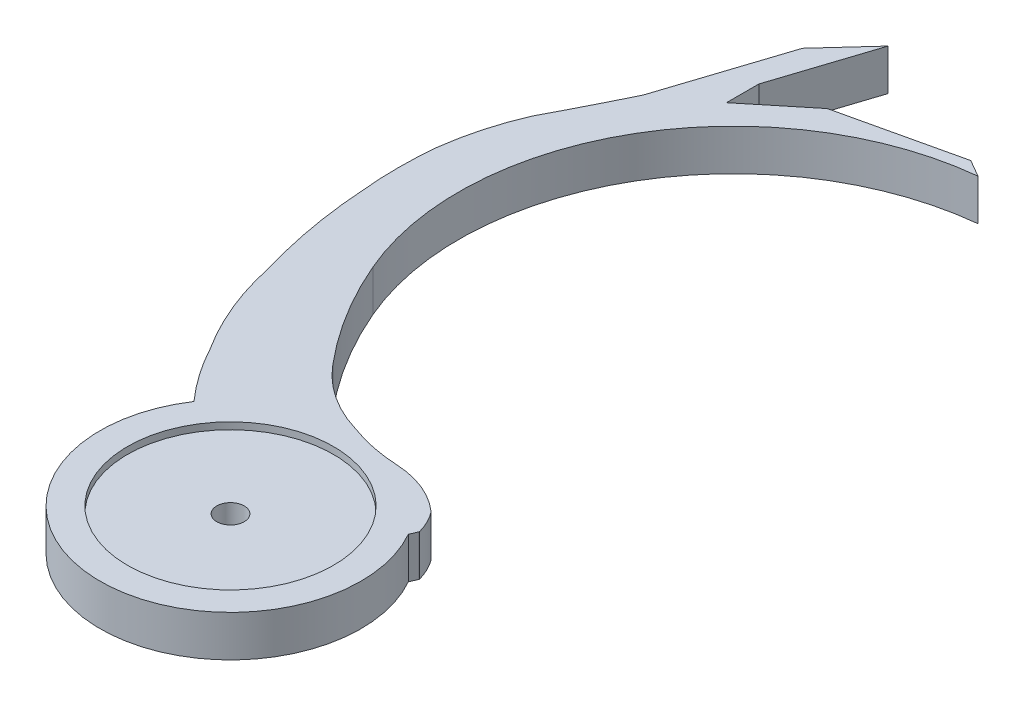
ISO-10303-21;
HEADER;
FILE_DESCRIPTION(('STEP AP214'),'2;1');
FILE_NAME('part.step','',(''),(''),'','','');
FILE_SCHEMA(('AUTOMOTIVE_DESIGN { 1 0 10303 214 1 1 1 1 }'));
ENDSEC;
DATA;
#1=APPLICATION_CONTEXT('core data for automotive mechanical design processes');
#2=APPLICATION_PROTOCOL_DEFINITION('international standard','automotive_design',2000,#1);
#3=PRODUCT_CONTEXT('',#1,'mechanical');
#4=PRODUCT('Part','Part','',(#3));
#5=PRODUCT_RELATED_PRODUCT_CATEGORY('part','',(#4));
#6=PRODUCT_DEFINITION_FORMATION('','',#4);
#7=PRODUCT_DEFINITION_CONTEXT('part definition',#1,'design');
#8=PRODUCT_DEFINITION('design','',#6,#7);
#9=PRODUCT_DEFINITION_SHAPE('','',#8);
#10=(LENGTH_UNIT() NAMED_UNIT(*) SI_UNIT(.MILLI.,.METRE.));
#11=(NAMED_UNIT(*) PLANE_ANGLE_UNIT() SI_UNIT($,.RADIAN.));
#12=(NAMED_UNIT(*) SI_UNIT($,.STERADIAN.) SOLID_ANGLE_UNIT());
#13=UNCERTAINTY_MEASURE_WITH_UNIT(LENGTH_MEASURE(1.E-05),#10,'distance_accuracy_value','');
#14=(GEOMETRIC_REPRESENTATION_CONTEXT(3) GLOBAL_UNCERTAINTY_ASSIGNED_CONTEXT((#13)) GLOBAL_UNIT_ASSIGNED_CONTEXT((#10,
#11,#12)) REPRESENTATION_CONTEXT('',''));
#15=CARTESIAN_POINT('',(0.,0.,0.));
#16=DIRECTION('',(0.,0.,1.));
#17=DIRECTION('',(1.,0.,0.));
#18=AXIS2_PLACEMENT_3D('',#15,#16,#17);
#19=CARTESIAN_POINT('',(-9.66416609923461,4.18336290354014,36.323394248226));
#20=DIRECTION('',(0.,-1.,0.));
#21=DIRECTION('',(0.,0.,-1.));
#22=AXIS2_PLACEMENT_3D('',#19,#20,#21);
#23=CYLINDRICAL_SURFACE('',#22,1.75);
#24=CARTESIAN_POINT('',(-9.66416609923461,-1.06663709645986,36.323394248226));
#25=DIRECTION('',(0.,1.,0.));
#26=DIRECTION('',(0.,0.,1.));
#27=AXIS2_PLACEMENT_3D('',#24,#25,#26);
#28=CIRCLE('',#27,1.75);
#29=CARTESIAN_POINT('',(-9.66416609923461,-1.06663709645986,38.073394248226));
#30=VERTEX_POINT('',#29);
#31=EDGE_CURVE('E267',#30,#30,#28,.T.);
#32=ORIENTED_EDGE('',*,*,#31,.F.);
#33=EDGE_LOOP('',(#32));
#34=FACE_BOUND('',#33,.T.);
#35=CARTESIAN_POINT('',(-9.66416609923461,3.30836290354015,36.323394248226));
#36=DIRECTION('',(0.,1.,0.));
#37=DIRECTION('',(0.,0.,1.));
#38=AXIS2_PLACEMENT_3D('',#35,#36,#37);
#39=CIRCLE('',#38,1.75);
#40=CARTESIAN_POINT('',(-9.66416609923461,3.30836290354015,38.073394248226));
#41=VERTEX_POINT('',#40);
#42=EDGE_CURVE('E45',#41,#41,#39,.T.);
#43=ORIENTED_EDGE('',*,*,#42,.T.);
#44=EDGE_LOOP('',(#43));
#45=FACE_BOUND('',#44,.T.);
#46=ADVANCED_FACE('F41',(#34,#45),#23,.F.);
#47=CARTESIAN_POINT('',(-22.562440081917,4.18336290354014,-11.3836875645976));
#48=DIRECTION('',(1.,0.,0.));
#49=DIRECTION('',(0.,0.,-1.));
#50=AXIS2_PLACEMENT_3D('',#47,#48,#49);
#51=PLANE('',#50);
#52=DIRECTION('',(0.,0.,1.));
#53=VECTOR('',#52,1.);
#54=CARTESIAN_POINT('',(-22.562440081917,-1.06663709645986,-11.3836875645976));
#55=LINE('',#54,#53);
#56=CARTESIAN_POINT('',(-22.5624400819171,-1.06663709645986,-43.9022030869811));
#57=VERTEX_POINT('',#56);
#58=CARTESIAN_POINT('',(-22.5624400819171,-1.06663709645986,-39.7742396032978));
#59=VERTEX_POINT('',#58);
#60=EDGE_CURVE('E219',#57,#59,#55,.T.);
#61=ORIENTED_EDGE('',*,*,#60,.F.);
#62=DIRECTION('',(0.,-1.,0.));
#63=VECTOR('',#62,1.);
#64=CARTESIAN_POINT('',(-22.5624400819171,4.18336290354014,-43.9022030869811));
#65=LINE('',#64,#63);
#66=CARTESIAN_POINT('',(-22.5624400819171,4.18336290354014,-43.9022030869811));
#67=VERTEX_POINT('',#66);
#68=EDGE_CURVE('E11',#67,#57,#65,.T.);
#69=ORIENTED_EDGE('',*,*,#68,.F.);
#70=DIRECTION('',(0.,0.,1.));
#71=VECTOR('',#70,1.);
#72=CARTESIAN_POINT('',(-22.562440081917,4.18336290354014,-11.3836875645976));
#73=LINE('',#72,#71);
#74=CARTESIAN_POINT('',(-22.5624400819171,4.18336290354014,-39.7742396032978));
#75=VERTEX_POINT('',#74);
#76=EDGE_CURVE('E270',#67,#75,#73,.T.);
#77=ORIENTED_EDGE('',*,*,#76,.T.);
#78=DIRECTION('',(0.,-1.,0.));
#79=VECTOR('',#78,1.);
#80=CARTESIAN_POINT('',(-22.5624400819171,4.18336290354014,-39.7742396032978));
#81=LINE('',#80,#79);
#82=EDGE_CURVE('E135',#75,#59,#81,.T.);
#83=ORIENTED_EDGE('',*,*,#82,.T.);
#84=EDGE_LOOP('',(#61,#69,#77,#83));
#85=FACE_BOUND('',#84,.T.);
#86=ADVANCED_FACE('F43',(#85),#51,.T.);
#87=CARTESIAN_POINT('',(-28.7450944321391,4.18336290354014,-24.9176323786269));
#88=DIRECTION('',(0.9508473764207,0.,0.30965992112941));
#89=DIRECTION('',(0.30965992112941,0.,-0.9508473764207));
#90=AXIS2_PLACEMENT_3D('',#87,#88,#89);
#91=PLANE('',#90);
#92=DIRECTION('',(-0.30965992112941,0.,0.9508473764207));
#93=VECTOR('',#92,1.);
#94=CARTESIAN_POINT('',(-28.7450944321391,-1.06663709645986,-24.9176323786269));
#95=LINE('',#94,#93);
#96=CARTESIAN_POINT('',(-18.5190078594824,-1.06663709645986,-56.3180394871661));
#97=VERTEX_POINT('',#96);
#98=EDGE_CURVE('E222',#97,#57,#95,.T.);
#99=ORIENTED_EDGE('',*,*,#98,.F.);
#100=DIRECTION('',(0.,-1.,0.));
#101=VECTOR('',#100,1.);
#102=CARTESIAN_POINT('',(-18.5190078594824,4.18336290354014,-56.3180394871661));
#103=LINE('',#102,#101);
#104=CARTESIAN_POINT('',(-18.5190078594824,4.18336290354014,-56.3180394871661));
#105=VERTEX_POINT('',#104);
#106=EDGE_CURVE('E51',#105,#97,#103,.T.);
#107=ORIENTED_EDGE('',*,*,#106,.F.);
#108=DIRECTION('',(-0.30965992112941,0.,0.9508473764207));
#109=VECTOR('',#108,1.);
#110=CARTESIAN_POINT('',(-28.7450944321391,4.18336290354014,-24.9176323786269));
#111=LINE('',#110,#109);
#112=EDGE_CURVE('E336',#105,#67,#111,.T.);
#113=ORIENTED_EDGE('',*,*,#112,.T.);
#114=ORIENTED_EDGE('',*,*,#68,.T.);
#115=EDGE_LOOP('',(#99,#107,#113,#114));
#116=FACE_BOUND('',#115,.T.);
#117=ADVANCED_FACE('F335',(#116),#91,.T.);
#118=CARTESIAN_POINT('',(-26.6414658537518,4.18336290354014,-47.4269807712445));
#119=DIRECTION('',(0.738297960081065,0.,0.674474700889617));
#120=DIRECTION('',(0.674474700889617,0.,-0.738297960081065));
#121=AXIS2_PLACEMENT_3D('',#118,#119,#120);
#122=PLANE('',#121);
#123=DIRECTION('',(-0.674474700889617,0.,0.738297960081065));
#124=VECTOR('',#123,1.);
#125=CARTESIAN_POINT('',(-26.6414658537518,-1.06663709645986,-47.4269807712445));
#126=LINE('',#125,#124);
#127=CARTESIAN_POINT('',(-23.7263406167607,-1.06663709645986,-50.6179544475183));
#128=VERTEX_POINT('',#127);
#129=EDGE_CURVE('E225',#97,#128,#126,.T.);
#130=ORIENTED_EDGE('',*,*,#129,.T.);
#131=DIRECTION('',(0.,-1.,0.));
#132=VECTOR('',#131,1.);
#133=CARTESIAN_POINT('',(-23.7263406167607,4.18336290354014,-50.6179544475183));
#134=LINE('',#133,#132);
#135=CARTESIAN_POINT('',(-23.7263406167607,4.18336290354014,-50.6179544475183));
#136=VERTEX_POINT('',#135);
#137=EDGE_CURVE('E317',#136,#128,#134,.T.);
#138=ORIENTED_EDGE('',*,*,#137,.F.);
#139=DIRECTION('',(-0.674474700889617,0.,0.738297960081065));
#140=VECTOR('',#139,1.);
#141=CARTESIAN_POINT('',(-26.6414658537518,4.18336290354014,-47.4269807712445));
#142=LINE('',#141,#140);
#143=EDGE_CURVE('E325',#105,#136,#142,.T.);
#144=ORIENTED_EDGE('',*,*,#143,.F.);
#145=ORIENTED_EDGE('',*,*,#106,.T.);
#146=EDGE_LOOP('',(#130,#138,#144,#145));
#147=FACE_BOUND('',#146,.T.);
#148=ADVANCED_FACE('F323',(#147),#122,.F.);
#149=CARTESIAN_POINT('',(-31.7747706861074,4.18336290354014,-25.9042989384933));
#150=DIRECTION('',(0.950847376420702,0.,0.309659921129401));
#151=DIRECTION('',(0.309659921129401,0.,-0.950847376420702));
#152=AXIS2_PLACEMENT_3D('',#149,#150,#151);
#153=PLANE('',#152);
#154=DIRECTION('',(-0.309659921129401,0.,0.950847376420703));
#155=VECTOR('',#154,1.);
#156=CARTESIAN_POINT('',(-31.7747706861074,-1.06663709645986,-25.9042989384933));
#157=LINE('',#156,#155);
#158=CARTESIAN_POINT('',(-28.708043021893,-1.06663709645986,-35.3210485878498));
#159=VERTEX_POINT('',#158);
#160=EDGE_CURVE('E227',#128,#159,#157,.T.);
#161=ORIENTED_EDGE('',*,*,#160,.T.);
#162=DIRECTION('',(0.,-1.,0.));
#163=VECTOR('',#162,1.);
#164=CARTESIAN_POINT('',(-28.708043021893,4.18336290354014,-35.3210485878498));
#165=LINE('',#164,#163);
#166=CARTESIAN_POINT('',(-28.708043021893,4.18336290354014,-35.3210485878498));
#167=VERTEX_POINT('',#166);
#168=EDGE_CURVE('E314',#167,#159,#165,.T.);
#169=ORIENTED_EDGE('',*,*,#168,.F.);
#170=DIRECTION('',(-0.309659921129401,0.,0.950847376420703));
#171=VECTOR('',#170,1.);
#172=CARTESIAN_POINT('',(-31.7747706861074,4.18336290354014,-25.9042989384933));
#173=LINE('',#172,#171);
#174=EDGE_CURVE('E345',#136,#167,#173,.T.);
#175=ORIENTED_EDGE('',*,*,#174,.F.);
#176=ORIENTED_EDGE('',*,*,#137,.T.);
#177=EDGE_LOOP('',(#161,#169,#175,#176));
#178=FACE_BOUND('',#177,.T.);
#179=ADVANCED_FACE('F449',(#178),#153,.F.);
#180=CARTESIAN_POINT('',(-295.873895869123,4.18336290354014,-164.689659395593));
#181=DIRECTION('',(0.,-1.,0.));
#182=DIRECTION('',(0.,0.,-1.));
#183=AXIS2_PLACEMENT_3D('',#180,#181,#182);
#184=CYLINDRICAL_SURFACE('',#183,296.8397385626);
#185=CARTESIAN_POINT('',(-295.873895869123,-1.06663709645986,-164.689659395593));
#186=DIRECTION('',(0.,1.,0.));
#187=DIRECTION('',(0.,0.,1.));
#188=AXIS2_PLACEMENT_3D('',#185,#186,#187);
#189=CIRCLE('',#188,296.8397385626);
#190=CARTESIAN_POINT('',(-33.4652339449699,-1.06663709645986,-25.9253825189827));
#191=VERTEX_POINT('',#190);
#192=EDGE_CURVE('E229',#159,#191,#189,.F.);
#193=ORIENTED_EDGE('',*,*,#192,.T.);
#194=DIRECTION('',(0.,-1.,0.));
#195=VECTOR('',#194,1.);
#196=CARTESIAN_POINT('',(-33.4652339449699,4.18336290354014,-25.9253825189827));
#197=LINE('',#196,#195);
#198=CARTESIAN_POINT('',(-33.4652339449699,4.18336290354014,-25.9253825189827));
#199=VERTEX_POINT('',#198);
#200=EDGE_CURVE('E311',#199,#191,#197,.T.);
#201=ORIENTED_EDGE('',*,*,#200,.F.);
#202=CARTESIAN_POINT('',(-295.873895869123,4.18336290354014,-164.689659395593));
#203=DIRECTION('',(0.,1.,0.));
#204=DIRECTION('',(0.,0.,1.));
#205=AXIS2_PLACEMENT_3D('',#202,#203,#204);
#206=CIRCLE('',#205,296.8397385626);
#207=EDGE_CURVE('E347',#167,#199,#206,.F.);
#208=ORIENTED_EDGE('',*,*,#207,.F.);
#209=ORIENTED_EDGE('',*,*,#168,.T.);
#210=EDGE_LOOP('',(#193,#201,#208,#209));
#211=FACE_BOUND('',#210,.T.);
#212=ADVANCED_FACE('F444',(#211),#184,.F.);
#213=CARTESIAN_POINT('',(-1.11166103626463,4.18336290354014,-11.9503457248283));
#214=DIRECTION('',(0.,-1.,0.));
#215=DIRECTION('',(0.,0.,-1.));
#216=AXIS2_PLACEMENT_3D('',#213,#214,#215);
#217=CYLINDRICAL_SURFACE('',#216,35.2428054126922);
#218=CARTESIAN_POINT('',(-1.11166103626463,-1.06663709645986,-11.9503457248283));
#219=DIRECTION('',(0.,1.,0.));
#220=DIRECTION('',(0.,0.,1.));
#221=AXIS2_PLACEMENT_3D('',#218,#219,#220);
#222=CIRCLE('',#221,35.2428054126922);
#223=CARTESIAN_POINT('',(-36.0771724864214,-1.06663709645986,-16.3626401830255));
#224=VERTEX_POINT('',#223);
#225=EDGE_CURVE('E231',#191,#224,#222,.T.);
#226=ORIENTED_EDGE('',*,*,#225,.T.);
#227=DIRECTION('',(0.,-1.,0.));
#228=VECTOR('',#227,1.);
#229=CARTESIAN_POINT('',(-36.0771724864214,4.18336290354014,-16.3626401830255));
#230=LINE('',#229,#228);
#231=CARTESIAN_POINT('',(-36.0771724864214,4.18336290354014,-16.3626401830255));
#232=VERTEX_POINT('',#231);
#233=EDGE_CURVE('E308',#232,#224,#230,.T.);
#234=ORIENTED_EDGE('',*,*,#233,.F.);
#235=CARTESIAN_POINT('',(-1.11166103626463,4.18336290354014,-11.9503457248283));
#236=DIRECTION('',(0.,1.,0.));
#237=DIRECTION('',(0.,0.,1.));
#238=AXIS2_PLACEMENT_3D('',#235,#236,#237);
#239=CIRCLE('',#238,35.2428054126922);
#240=EDGE_CURVE('E349',#199,#232,#239,.T.);
#241=ORIENTED_EDGE('',*,*,#240,.F.);
#242=ORIENTED_EDGE('',*,*,#200,.T.);
#243=EDGE_LOOP('',(#226,#234,#241,#242));
#244=FACE_BOUND('',#243,.T.);
#245=ADVANCED_FACE('F441',(#244),#217,.T.);
#246=CARTESIAN_POINT('',(11.2084770385272,4.18336290354014,-11.6995461847937));
#247=DIRECTION('',(0.,-1.,0.));
#248=DIRECTION('',(0.,0.,-1.));
#249=AXIS2_PLACEMENT_3D('',#246,#247,#248);
#250=CYLINDRICAL_SURFACE('',#249,47.5150196951725);
#251=CARTESIAN_POINT('',(11.2084770385272,-1.06663709645986,-11.6995461847937));
#252=DIRECTION('',(0.,1.,0.));
#253=DIRECTION('',(0.,0.,1.));
#254=AXIS2_PLACEMENT_3D('',#251,#252,#253);
#255=CIRCLE('',#254,47.5150196951725);
#256=CARTESIAN_POINT('',(-36.0771724864217,-1.06663709645986,-7.03645218656274));
#257=VERTEX_POINT('',#256);
#258=EDGE_CURVE('E233',#224,#257,#255,.T.);
#259=ORIENTED_EDGE('',*,*,#258,.T.);
#260=DIRECTION('',(0.,-1.,0.));
#261=VECTOR('',#260,1.);
#262=CARTESIAN_POINT('',(-36.0771724864217,4.18336290354014,-7.03645218656274));
#263=LINE('',#262,#261);
#264=CARTESIAN_POINT('',(-36.0771724864217,4.18336290354014,-7.03645218656274));
#265=VERTEX_POINT('',#264);
#266=EDGE_CURVE('E305',#265,#257,#263,.T.);
#267=ORIENTED_EDGE('',*,*,#266,.F.);
#268=CARTESIAN_POINT('',(11.2084770385272,4.18336290354014,-11.6995461847937));
#269=DIRECTION('',(0.,1.,0.));
#270=DIRECTION('',(0.,0.,1.));
#271=AXIS2_PLACEMENT_3D('',#268,#269,#270);
#272=CIRCLE('',#271,47.5150196951725);
#273=EDGE_CURVE('E351',#232,#265,#272,.T.);
#274=ORIENTED_EDGE('',*,*,#273,.F.);
#275=ORIENTED_EDGE('',*,*,#233,.T.);
#276=EDGE_LOOP('',(#259,#267,#274,#275));
#277=FACE_BOUND('',#276,.T.);
#278=ADVANCED_FACE('F437',(#277),#250,.T.);
#279=CARTESIAN_POINT('',(30.3596903971524,4.18336290354014,-11.3073960036638));
#280=DIRECTION('',(0.,-1.,0.));
#281=DIRECTION('',(0.,0.,-1.));
#282=AXIS2_PLACEMENT_3D('',#279,#280,#281);
#283=CYLINDRICAL_SURFACE('',#282,66.5740017641998);
#284=CARTESIAN_POINT('',(30.3596903971524,-1.06663709645986,-11.3073960036638));
#285=DIRECTION('',(0.,1.,0.));
#286=DIRECTION('',(0.,0.,1.));
#287=AXIS2_PLACEMENT_3D('',#284,#285,#286);
#288=CIRCLE('',#287,66.5740017641998);
#289=CARTESIAN_POINT('',(-33.4652339449706,-1.06663709645986,7.62608607497011));
#290=VERTEX_POINT('',#289);
#291=EDGE_CURVE('E235',#257,#290,#288,.T.);
#292=ORIENTED_EDGE('',*,*,#291,.T.);
#293=DIRECTION('',(0.,-1.,0.));
#294=VECTOR('',#293,1.);
#295=CARTESIAN_POINT('',(-33.4652339449706,4.18336290354014,7.62608607497011));
#296=LINE('',#295,#294);
#297=CARTESIAN_POINT('',(-33.4652339449706,4.18336290354014,7.62608607497011));
#298=VERTEX_POINT('',#297);
#299=EDGE_CURVE('E302',#298,#290,#296,.T.);
#300=ORIENTED_EDGE('',*,*,#299,.F.);
#301=CARTESIAN_POINT('',(30.3596903971524,4.18336290354014,-11.3073960036638));
#302=DIRECTION('',(0.,1.,0.));
#303=DIRECTION('',(0.,0.,1.));
#304=AXIS2_PLACEMENT_3D('',#301,#302,#303);
#305=CIRCLE('',#304,66.5740017641998);
#306=EDGE_CURVE('E353',#265,#298,#305,.T.);
#307=ORIENTED_EDGE('',*,*,#306,.F.);
#308=ORIENTED_EDGE('',*,*,#266,.T.);
#309=EDGE_LOOP('',(#292,#300,#307,#308));
#310=FACE_BOUND('',#309,.T.);
#311=ADVANCED_FACE('F432',(#310),#283,.T.);
#312=CARTESIAN_POINT('',(3.46931508674213,4.18336290354014,-0.0838468615025323));
#313=DIRECTION('',(0.,-1.,0.));
#314=DIRECTION('',(0.,0.,-1.));
#315=AXIS2_PLACEMENT_3D('',#312,#313,#314);
#316=CYLINDRICAL_SURFACE('',#315,37.7306768831535);
#317=CARTESIAN_POINT('',(3.46931508674213,-1.06663709645986,-0.0838468615025323));
#318=DIRECTION('',(0.,1.,0.));
#319=DIRECTION('',(0.,0.,1.));
#320=AXIS2_PLACEMENT_3D('',#317,#318,#319);
#321=CIRCLE('',#320,37.7306768831535);
#322=CARTESIAN_POINT('',(-28.2921737135603,-1.06663709645986,20.283082392786));
#323=VERTEX_POINT('',#322);
#324=EDGE_CURVE('E237',#290,#323,#321,.T.);
#325=ORIENTED_EDGE('',*,*,#324,.T.);
#326=DIRECTION('',(0.,-1.,0.));
#327=VECTOR('',#326,1.);
#328=CARTESIAN_POINT('',(-28.2921737135603,4.18336290354014,20.283082392786));
#329=LINE('',#328,#327);
#330=CARTESIAN_POINT('',(-28.2921737135603,4.18336290354014,20.283082392786));
#331=VERTEX_POINT('',#330);
#332=EDGE_CURVE('E299',#331,#323,#329,.T.);
#333=ORIENTED_EDGE('',*,*,#332,.F.);
#334=CARTESIAN_POINT('',(3.46931508674213,4.18336290354014,-0.0838468615025323));
#335=DIRECTION('',(0.,1.,0.));
#336=DIRECTION('',(0.,0.,1.));
#337=AXIS2_PLACEMENT_3D('',#334,#335,#336);
#338=CIRCLE('',#337,37.7306768831535);
#339=EDGE_CURVE('E355',#298,#331,#338,.T.);
#340=ORIENTED_EDGE('',*,*,#339,.F.);
#341=ORIENTED_EDGE('',*,*,#299,.T.);
#342=EDGE_LOOP('',(#325,#333,#340,#341));
#343=FACE_BOUND('',#342,.T.);
#344=ADVANCED_FACE('F426',(#343),#316,.T.);
#345=CARTESIAN_POINT('',(3.06716016202229,4.18336290354014,3.48158752148588));
#346=DIRECTION('',(0.,-1.,0.));
#347=DIRECTION('',(0.,0.,-1.));
#348=AXIS2_PLACEMENT_3D('',#345,#346,#347);
#349=CYLINDRICAL_SURFACE('',#348,35.5766503627102);
#350=CARTESIAN_POINT('',(3.06716016202229,-1.06663709645986,3.48158752148588));
#351=DIRECTION('',(0.,1.,0.));
#352=DIRECTION('',(0.,0.,1.));
#353=AXIS2_PLACEMENT_3D('',#350,#351,#352);
#354=CIRCLE('',#353,35.5766503627102);
#355=CARTESIAN_POINT('',(-23.5142574569107,-1.06663709645986,27.1274389207993));
#356=VERTEX_POINT('',#355);
#357=EDGE_CURVE('E239',#323,#356,#354,.T.);
#358=ORIENTED_EDGE('',*,*,#357,.T.);
#359=DIRECTION('',(0.,-1.,0.));
#360=VECTOR('',#359,1.);
#361=CARTESIAN_POINT('',(-23.5142574569107,4.18336290354014,27.1274389207993));
#362=LINE('',#361,#360);
#363=CARTESIAN_POINT('',(-23.5142574569107,4.18336290354014,27.1274389207993));
#364=VERTEX_POINT('',#363);
#365=EDGE_CURVE('E296',#364,#356,#362,.T.);
#366=ORIENTED_EDGE('',*,*,#365,.F.);
#367=CARTESIAN_POINT('',(3.06716016202229,4.18336290354014,3.48158752148588));
#368=DIRECTION('',(0.,1.,0.));
#369=DIRECTION('',(0.,0.,1.));
#370=AXIS2_PLACEMENT_3D('',#367,#368,#369);
#371=CIRCLE('',#370,35.5766503627102);
#372=EDGE_CURVE('E357',#331,#364,#371,.T.);
#373=ORIENTED_EDGE('',*,*,#372,.F.);
#374=ORIENTED_EDGE('',*,*,#332,.T.);
#375=EDGE_LOOP('',(#358,#366,#373,#374));
#376=FACE_BOUND('',#375,.T.);
#377=ADVANCED_FACE('F422',(#376),#349,.T.);
#378=CARTESIAN_POINT('',(-9.66416609923461,4.18336290354014,36.323394248226));
#379=DIRECTION('',(0.,-1.,0.));
#380=DIRECTION('',(0.,0.,-1.));
#381=AXIS2_PLACEMENT_3D('',#378,#379,#380);
#382=CYLINDRICAL_SURFACE('',#381,16.625);
#383=CARTESIAN_POINT('',(-9.66416609923461,-1.06663709645986,36.323394248226));
#384=DIRECTION('',(0.,1.,0.));
#385=DIRECTION('',(0.,0.,1.));
#386=AXIS2_PLACEMENT_3D('',#383,#384,#385);
#387=CIRCLE('',#386,16.625);
#388=CARTESIAN_POINT('',(4.79349583227801,-1.06663709645986,28.1156761442648));
#389=VERTEX_POINT('',#388);
#390=EDGE_CURVE('E241',#356,#389,#387,.T.);
#391=ORIENTED_EDGE('',*,*,#390,.T.);
#392=DIRECTION('',(0.,-1.,0.));
#393=VECTOR('',#392,1.);
#394=CARTESIAN_POINT('',(4.79349583227801,4.18336290354014,28.1156761442648));
#395=LINE('',#394,#393);
#396=CARTESIAN_POINT('',(4.79349583227801,4.18336290354014,28.1156761442648));
#397=VERTEX_POINT('',#396);
#398=EDGE_CURVE('E294',#397,#389,#395,.T.);
#399=ORIENTED_EDGE('',*,*,#398,.F.);
#400=CARTESIAN_POINT('',(-9.66416609923461,4.18336290354014,36.323394248226));
#401=DIRECTION('',(0.,1.,0.));
#402=DIRECTION('',(0.,0.,1.));
#403=AXIS2_PLACEMENT_3D('',#400,#401,#402);
#404=CIRCLE('',#403,16.625);
#405=EDGE_CURVE('E359',#364,#397,#404,.T.);
#406=ORIENTED_EDGE('',*,*,#405,.F.);
#407=ORIENTED_EDGE('',*,*,#365,.T.);
#408=EDGE_LOOP('',(#391,#399,#406,#407));
#409=FACE_BOUND('',#408,.T.);
#410=ADVANCED_FACE('F417',(#409),#382,.T.);
#411=CARTESIAN_POINT('',(-16.4170273846854,4.18336290354014,18.3143532362968));
#412=DIRECTION('',(0.,-1.,0.));
#413=DIRECTION('',(0.,0.,-1.));
#414=AXIS2_PLACEMENT_3D('',#411,#412,#413);
#415=CYLINDRICAL_SURFACE('',#414,23.3656205970139);
#416=CARTESIAN_POINT('',(-16.4170273846854,-1.06663709645986,18.3143532362968));
#417=DIRECTION('',(0.,1.,0.));
#418=DIRECTION('',(0.,0.,1.));
#419=AXIS2_PLACEMENT_3D('',#416,#417,#418);
#420=CIRCLE('',#419,23.3656205970139);
#421=CARTESIAN_POINT('',(5.20948538279702,-1.06663709645986,27.160039834946));
#422=VERTEX_POINT('',#421);
#423=EDGE_CURVE('E244',#422,#389,#420,.F.);
#424=ORIENTED_EDGE('',*,*,#423,.F.);
#425=DIRECTION('',(0.,-1.,0.));
#426=VECTOR('',#425,1.);
#427=CARTESIAN_POINT('',(5.20948538279702,4.18336290354014,27.160039834946));
#428=LINE('',#427,#426);
#429=CARTESIAN_POINT('',(5.20948538279702,4.18336290354014,27.160039834946));
#430=VERTEX_POINT('',#429);
#431=EDGE_CURVE('E292',#430,#422,#428,.T.);
#432=ORIENTED_EDGE('',*,*,#431,.F.);
#433=CARTESIAN_POINT('',(-16.4170273846854,4.18336290354014,18.3143532362968));
#434=DIRECTION('',(0.,1.,0.));
#435=DIRECTION('',(0.,0.,1.));
#436=AXIS2_PLACEMENT_3D('',#433,#434,#435);
#437=CIRCLE('',#436,23.3656205970139);
#438=EDGE_CURVE('E361',#430,#397,#437,.F.);
#439=ORIENTED_EDGE('',*,*,#438,.T.);
#440=ORIENTED_EDGE('',*,*,#398,.T.);
#441=EDGE_LOOP('',(#424,#432,#439,#440));
#442=FACE_BOUND('',#441,.T.);
#443=ADVANCED_FACE('F411',(#442),#415,.T.);
#444=CARTESIAN_POINT('',(13.4560748934009,4.18336290354014,29.3685048818782));
#445=DIRECTION('',(0.,-1.,0.));
#446=DIRECTION('',(0.,0.,-1.));
#447=AXIS2_PLACEMENT_3D('',#444,#445,#446);
#448=CYLINDRICAL_SURFACE('',#447,8.53718668062977);
#449=CARTESIAN_POINT('',(13.4560748934009,-1.06663709645986,29.3685048818782));
#450=DIRECTION('',(0.,1.,0.));
#451=DIRECTION('',(0.,0.,1.));
#452=AXIS2_PLACEMENT_3D('',#449,#450,#451);
#453=CIRCLE('',#452,8.53718668062977);
#454=CARTESIAN_POINT('',(5.22205920493274,-1.06663709645986,27.1136119660209));
#455=VERTEX_POINT('',#454);
#456=EDGE_CURVE('E247',#422,#455,#453,.F.);
#457=ORIENTED_EDGE('',*,*,#456,.T.);
#458=DIRECTION('',(0.,-1.,0.));
#459=VECTOR('',#458,1.);
#460=CARTESIAN_POINT('',(5.22205920493274,4.18336290354014,27.1136119660209));
#461=LINE('',#460,#459);
#462=CARTESIAN_POINT('',(5.22205920493274,4.18336290354014,27.1136119660209));
#463=VERTEX_POINT('',#462);
#464=EDGE_CURVE('E289',#463,#455,#461,.T.);
#465=ORIENTED_EDGE('',*,*,#464,.F.);
#466=CARTESIAN_POINT('',(13.4560748934009,4.18336290354014,29.3685048818782));
#467=DIRECTION('',(0.,1.,0.));
#468=DIRECTION('',(0.,0.,1.));
#469=AXIS2_PLACEMENT_3D('',#466,#467,#468);
#470=CIRCLE('',#469,8.53718668062977);
#471=EDGE_CURVE('E364',#430,#463,#470,.F.);
#472=ORIENTED_EDGE('',*,*,#471,.F.);
#473=ORIENTED_EDGE('',*,*,#431,.T.);
#474=EDGE_LOOP('',(#457,#465,#472,#473));
#475=FACE_BOUND('',#474,.T.);
#476=ADVANCED_FACE('F408',(#475),#448,.F.);
#477=CARTESIAN_POINT('',(-3.01195648353539,4.18336290354014,29.3685048818782));
#478=DIRECTION('',(0.,-1.,0.));
#479=DIRECTION('',(0.,0.,-1.));
#480=AXIS2_PLACEMENT_3D('',#477,#478,#479);
#481=CYLINDRICAL_SURFACE('',#480,8.53718668062977);
#482=CARTESIAN_POINT('',(-3.01195648353539,-1.06663709645986,29.3685048818782));
#483=DIRECTION('',(0.,1.,0.));
#484=DIRECTION('',(0.,0.,1.));
#485=AXIS2_PLACEMENT_3D('',#482,#483,#484);
#486=CIRCLE('',#485,8.53718668062977);
#487=CARTESIAN_POINT('',(3.79038949061149,-1.06663709645986,24.2098572230503));
#488=VERTEX_POINT('',#487);
#489=EDGE_CURVE('E249',#455,#488,#486,.T.);
#490=ORIENTED_EDGE('',*,*,#489,.T.);
#491=DIRECTION('',(0.,-1.,0.));
#492=VECTOR('',#491,1.);
#493=CARTESIAN_POINT('',(3.79038949061149,4.18336290354014,24.2098572230503));
#494=LINE('',#493,#492);
#495=CARTESIAN_POINT('',(3.79038949061149,4.18336290354014,24.2098572230503));
#496=VERTEX_POINT('',#495);
#497=EDGE_CURVE('E286',#496,#488,#494,.T.);
#498=ORIENTED_EDGE('',*,*,#497,.F.);
#499=CARTESIAN_POINT('',(-3.01195648353539,4.18336290354014,29.3685048818782));
#500=DIRECTION('',(0.,1.,0.));
#501=DIRECTION('',(0.,0.,1.));
#502=AXIS2_PLACEMENT_3D('',#499,#500,#501);
#503=CIRCLE('',#502,8.53718668062977);
#504=EDGE_CURVE('E366',#463,#496,#503,.T.);
#505=ORIENTED_EDGE('',*,*,#504,.F.);
#506=ORIENTED_EDGE('',*,*,#464,.T.);
#507=EDGE_LOOP('',(#490,#498,#505,#506));
#508=FACE_BOUND('',#507,.T.);
#509=ADVANCED_FACE('F403',(#508),#481,.T.);
#510=CARTESIAN_POINT('',(-4.14462649044133,4.18336290354014,33.1042035083881));
#511=DIRECTION('',(0.,-1.,0.));
#512=DIRECTION('',(0.,0.,-1.));
#513=AXIS2_PLACEMENT_3D('',#510,#511,#512);
#514=CYLINDRICAL_SURFACE('',#513,11.9194745883812);
#515=CARTESIAN_POINT('',(-4.14462649044133,-1.06663709645986,33.1042035083881));
#516=DIRECTION('',(0.,1.,0.));
#517=DIRECTION('',(0.,0.,1.));
#518=AXIS2_PLACEMENT_3D('',#515,#516,#517);
#519=CIRCLE('',#518,11.9194745883812);
#520=CARTESIAN_POINT('',(-3.57079659150943,-1.06663709645986,21.1985496535947));
#521=VERTEX_POINT('',#520);
#522=EDGE_CURVE('E251',#488,#521,#519,.T.);
#523=ORIENTED_EDGE('',*,*,#522,.T.);
#524=DIRECTION('',(0.,-1.,0.));
#525=VECTOR('',#524,1.);
#526=CARTESIAN_POINT('',(-3.57079659150943,4.18336290354014,21.1985496535947));
#527=LINE('',#526,#525);
#528=CARTESIAN_POINT('',(-3.57079659150943,4.18336290354014,21.1985496535947));
#529=VERTEX_POINT('',#528);
#530=EDGE_CURVE('E283',#529,#521,#527,.T.);
#531=ORIENTED_EDGE('',*,*,#530,.F.);
#532=CARTESIAN_POINT('',(-4.14462649044133,4.18336290354014,33.1042035083881));
#533=DIRECTION('',(0.,1.,0.));
#534=DIRECTION('',(0.,0.,1.));
#535=AXIS2_PLACEMENT_3D('',#532,#533,#534);
#536=CIRCLE('',#535,11.9194745883812);
#537=EDGE_CURVE('E368',#496,#529,#536,.T.);
#538=ORIENTED_EDGE('',*,*,#537,.F.);
#539=ORIENTED_EDGE('',*,*,#497,.T.);
#540=EDGE_LOOP('',(#523,#531,#538,#539));
#541=FACE_BOUND('',#540,.T.);
#542=ADVANCED_FACE('F397',(#541),#514,.T.);
#543=CARTESIAN_POINT('',(-2.50499563247774,4.18336290354014,-0.91437496040141));
#544=DIRECTION('',(0.,-1.,0.));
#545=DIRECTION('',(0.,0.,-1.));
#546=AXIS2_PLACEMENT_3D('',#543,#544,#545);
#547=CYLINDRICAL_SURFACE('',#546,22.1385945052649);
#548=CARTESIAN_POINT('',(-2.50499563247774,-1.06663709645986,-0.91437496040141));
#549=DIRECTION('',(0.,1.,0.));
#550=DIRECTION('',(0.,0.,1.));
#551=AXIS2_PLACEMENT_3D('',#548,#549,#550);
#552=CIRCLE('',#551,22.1385945052649);
#553=CARTESIAN_POINT('',(-10.2003482828133,-1.06663709645986,19.8437298243693));
#554=VERTEX_POINT('',#553);
#555=EDGE_CURVE('E253',#521,#554,#552,.F.);
#556=ORIENTED_EDGE('',*,*,#555,.T.);
#557=DIRECTION('',(0.,-1.,0.));
#558=VECTOR('',#557,1.);
#559=CARTESIAN_POINT('',(-10.2003482828133,4.18336290354014,19.8437298243693));
#560=LINE('',#559,#558);
#561=CARTESIAN_POINT('',(-10.2003482828133,4.18336290354014,19.8437298243693));
#562=VERTEX_POINT('',#561);
#563=EDGE_CURVE('E280',#562,#554,#560,.T.);
#564=ORIENTED_EDGE('',*,*,#563,.F.);
#565=CARTESIAN_POINT('',(-2.50499563247774,4.18336290354014,-0.91437496040141));
#566=DIRECTION('',(0.,1.,0.));
#567=DIRECTION('',(0.,0.,1.));
#568=AXIS2_PLACEMENT_3D('',#565,#566,#567);
#569=CIRCLE('',#568,22.1385945052649);
#570=EDGE_CURVE('E370',#529,#562,#569,.F.);
#571=ORIENTED_EDGE('',*,*,#570,.F.);
#572=ORIENTED_EDGE('',*,*,#530,.T.);
#573=EDGE_LOOP('',(#556,#564,#571,#572));
#574=FACE_BOUND('',#573,.T.);
#575=ADVANCED_FACE('F393',(#574),#547,.F.);
#576=CARTESIAN_POINT('',(-5.25354003598053,4.18336290354014,3.06597548894517));
#577=DIRECTION('',(0.,-1.,0.));
#578=DIRECTION('',(0.,0.,-1.));
#579=AXIS2_PLACEMENT_3D('',#576,#577,#578);
#580=CYLINDRICAL_SURFACE('',#579,17.4918253012879);
#581=CARTESIAN_POINT('',(-5.25354003598053,-1.06663709645986,3.06597548894517));
#582=DIRECTION('',(0.,1.,0.));
#583=DIRECTION('',(0.,0.,1.));
#584=AXIS2_PLACEMENT_3D('',#581,#582,#583);
#585=CIRCLE('',#584,17.4918253012879);
#586=CARTESIAN_POINT('',(-18.7056623503037,-1.06663709645986,14.2465102530458));
#587=VERTEX_POINT('',#586);
#588=EDGE_CURVE('E255',#554,#587,#585,.F.);
#589=ORIENTED_EDGE('',*,*,#588,.T.);
#590=DIRECTION('',(0.,-1.,0.));
#591=VECTOR('',#590,1.);
#592=CARTESIAN_POINT('',(-18.7056623503037,4.18336290354014,14.2465102530458));
#593=LINE('',#592,#591);
#594=CARTESIAN_POINT('',(-18.7056623503037,4.18336290354014,14.2465102530458));
#595=VERTEX_POINT('',#594);
#596=EDGE_CURVE('E277',#595,#587,#593,.T.);
#597=ORIENTED_EDGE('',*,*,#596,.F.);
#598=CARTESIAN_POINT('',(-5.25354003598053,4.18336290354014,3.06597548894517));
#599=DIRECTION('',(0.,1.,0.));
#600=DIRECTION('',(0.,0.,1.));
#601=AXIS2_PLACEMENT_3D('',#598,#599,#600);
#602=CIRCLE('',#601,17.4918253012879);
#603=EDGE_CURVE('E372',#562,#595,#602,.F.);
#604=ORIENTED_EDGE('',*,*,#603,.F.);
#605=ORIENTED_EDGE('',*,*,#563,.T.);
#606=EDGE_LOOP('',(#589,#597,#604,#605));
#607=FACE_BOUND('',#606,.T.);
#608=ADVANCED_FACE('F389',(#607),#580,.F.);
#609=CARTESIAN_POINT('',(21.7921186772506,4.18336290354014,-19.9825397466189));
#610=DIRECTION('',(0.,-1.,0.));
#611=DIRECTION('',(0.,0.,-1.));
#612=AXIS2_PLACEMENT_3D('',#609,#610,#611);
#613=CYLINDRICAL_SURFACE('',#612,53.0254479663801);
#614=CARTESIAN_POINT('',(21.7921186772506,-1.06663709645986,-19.9825397466189));
#615=DIRECTION('',(0.,1.,0.));
#616=DIRECTION('',(0.,0.,1.));
#617=AXIS2_PLACEMENT_3D('',#614,#615,#616);
#618=CIRCLE('',#617,53.0254479663801);
#619=CARTESIAN_POINT('',(-26.9520139505759,-1.06663709645986,0.891071977185619));
#620=VERTEX_POINT('',#619);
#621=EDGE_CURVE('E257',#587,#620,#618,.F.);
#622=ORIENTED_EDGE('',*,*,#621,.T.);
#623=DIRECTION('',(0.,-1.,0.));
#624=VECTOR('',#623,1.);
#625=CARTESIAN_POINT('',(-26.9520139505759,4.18336290354014,0.891071977185619));
#626=LINE('',#625,#624);
#627=CARTESIAN_POINT('',(-26.9520139505759,4.18336290354014,0.891071977185619));
#628=VERTEX_POINT('',#627);
#629=EDGE_CURVE('E274',#628,#620,#626,.T.);
#630=ORIENTED_EDGE('',*,*,#629,.F.);
#631=CARTESIAN_POINT('',(21.7921186772506,4.18336290354014,-19.9825397466189));
#632=DIRECTION('',(0.,1.,0.));
#633=DIRECTION('',(0.,0.,1.));
#634=AXIS2_PLACEMENT_3D('',#631,#632,#633);
#635=CIRCLE('',#634,53.0254479663801);
#636=EDGE_CURVE('E374',#595,#628,#635,.F.);
#637=ORIENTED_EDGE('',*,*,#636,.F.);
#638=ORIENTED_EDGE('',*,*,#596,.T.);
#639=EDGE_LOOP('',(#622,#630,#637,#638));
#640=FACE_BOUND('',#639,.T.);
#641=ADVANCED_FACE('F380',(#640),#613,.F.);
#642=CARTESIAN_POINT('',(5.22205920493274,4.18336290354014,-12.886773158538));
#643=DIRECTION('',(0.,-1.,0.));
#644=DIRECTION('',(0.,0.,-1.));
#645=AXIS2_PLACEMENT_3D('',#642,#643,#644);
#646=CYLINDRICAL_SURFACE('',#645,35.);
#647=CARTESIAN_POINT('',(5.22205920493274,-1.06663709645986,-12.886773158538));
#648=DIRECTION('',(0.,1.,0.));
#649=DIRECTION('',(0.,0.,1.));
#650=AXIS2_PLACEMENT_3D('',#647,#648,#649);
#651=CIRCLE('',#650,35.);
#652=CARTESIAN_POINT('',(1.5711765973419,-1.06663709645986,-47.695838876905));
#653=VERTEX_POINT('',#652);
#654=EDGE_CURVE('E259',#620,#653,#651,.F.);
#655=ORIENTED_EDGE('',*,*,#654,.T.);
#656=DIRECTION('',(0.,-1.,0.));
#657=VECTOR('',#656,1.);
#658=CARTESIAN_POINT('',(1.5711765973419,4.18336290354014,-47.695838876905));
#659=LINE('',#658,#657);
#660=CARTESIAN_POINT('',(1.5711765973419,4.18336290354014,-47.695838876905));
#661=VERTEX_POINT('',#660);
#662=EDGE_CURVE('E206',#661,#653,#659,.T.);
#663=ORIENTED_EDGE('',*,*,#662,.F.);
#664=CARTESIAN_POINT('',(5.22205920493274,4.18336290354014,-12.886773158538));
#665=DIRECTION('',(0.,1.,0.));
#666=DIRECTION('',(0.,0.,1.));
#667=AXIS2_PLACEMENT_3D('',#664,#665,#666);
#668=CIRCLE('',#667,35.);
#669=EDGE_CURVE('E211',#628,#661,#668,.F.);
#670=ORIENTED_EDGE('',*,*,#669,.F.);
#671=ORIENTED_EDGE('',*,*,#629,.T.);
#672=EDGE_LOOP('',(#655,#663,#670,#671));
#673=FACE_BOUND('',#672,.T.);
#674=ADVANCED_FACE('F384',(#673),#646,.F.);
#675=CARTESIAN_POINT('',(25.737236022188,4.18336290354014,-33.6994165266074));
#676=DIRECTION('',(0.501184996579342,0.,-0.865340163868386));
#677=DIRECTION('',(-0.865340163868386,0.,-0.501184996579342));
#678=AXIS2_PLACEMENT_3D('',#675,#676,#677);
#679=PLANE('',#678);
#680=DIRECTION('',(0.865340163868386,0.,0.501184996579342));
#681=VECTOR('',#680,1.);
#682=CARTESIAN_POINT('',(25.737236022188,-1.06663709645986,-33.6994165266074));
#683=LINE('',#682,#681);
#684=CARTESIAN_POINT('',(-0.606265385907522,-1.06663709645986,-48.9569628816526));
#685=VERTEX_POINT('',#684);
#686=EDGE_CURVE('E201',#685,#653,#683,.T.);
#687=ORIENTED_EDGE('',*,*,#686,.F.);
#688=DIRECTION('',(0.,-1.,0.));
#689=VECTOR('',#688,1.);
#690=CARTESIAN_POINT('',(-0.606265385907522,4.18336290354014,-48.9569628816526));
#691=LINE('',#690,#689);
#692=CARTESIAN_POINT('',(-0.606265385907522,4.18336290354014,-48.9569628816526));
#693=VERTEX_POINT('',#692);
#694=EDGE_CURVE('E196',#693,#685,#691,.T.);
#695=ORIENTED_EDGE('',*,*,#694,.F.);
#696=DIRECTION('',(0.865340163868386,0.,0.501184996579342));
#697=VECTOR('',#696,1.);
#698=CARTESIAN_POINT('',(25.737236022188,4.18336290354014,-33.6994165266074));
#699=LINE('',#698,#697);
#700=EDGE_CURVE('E199',#693,#661,#699,.T.);
#701=ORIENTED_EDGE('',*,*,#700,.T.);
#702=ORIENTED_EDGE('',*,*,#662,.T.);
#703=EDGE_LOOP('',(#687,#695,#701,#702));
#704=FACE_BOUND('',#703,.T.);
#705=ADVANCED_FACE('F198',(#704),#679,.T.);
#706=CARTESIAN_POINT('',(3.96269913456154,4.18336290354014,-50.0039355752669));
#707=DIRECTION('',(-0.223359601164946,0.,-0.974736112272155));
#708=DIRECTION('',(-0.974736112272156,0.,0.223359601164946));
#709=AXIS2_PLACEMENT_3D('',#706,#707,#708);
#710=PLANE('',#709);
#711=DIRECTION('',(0.974736112272156,0.,-0.223359601164946));
#712=VECTOR('',#711,1.);
#713=CARTESIAN_POINT('',(3.96269913456154,-1.06663709645986,-50.0039355752669));
#714=LINE('',#713,#712);
#715=CARTESIAN_POINT('',(-15.4901181034909,-1.06663709645986,-45.5463460337266));
#716=VERTEX_POINT('',#715);
#717=EDGE_CURVE('E263',#716,#685,#714,.T.);
#718=ORIENTED_EDGE('',*,*,#717,.F.);
#719=DIRECTION('',(0.,-1.,0.));
#720=VECTOR('',#719,1.);
#721=CARTESIAN_POINT('',(-15.4901181034909,4.18336290354014,-45.5463460337266));
#722=LINE('',#721,#720);
#723=CARTESIAN_POINT('',(-15.4901181034909,4.18336290354014,-45.5463460337266));
#724=VERTEX_POINT('',#723);
#725=EDGE_CURVE('E128',#724,#716,#722,.T.);
#726=ORIENTED_EDGE('',*,*,#725,.F.);
#727=DIRECTION('',(0.974736112272156,0.,-0.223359601164946));
#728=VECTOR('',#727,1.);
#729=CARTESIAN_POINT('',(3.96269913456154,4.18336290354014,-50.0039355752669));
#730=LINE('',#729,#728);
#731=EDGE_CURVE('E209',#724,#693,#730,.T.);
#732=ORIENTED_EDGE('',*,*,#731,.T.);
#733=ORIENTED_EDGE('',*,*,#694,.T.);
#734=EDGE_LOOP('',(#718,#726,#732,#733));
#735=FACE_BOUND('',#734,.T.);
#736=ADVANCED_FACE('F214',(#735),#710,.T.);
#737=CARTESIAN_POINT('',(-15.2376748923556,4.18336290354014,-45.7523786615901));
#738=DIRECTION('',(0.632296442931859,0.,0.774726537725227));
#739=DIRECTION('',(0.774726537725227,0.,-0.632296442931859));
#740=AXIS2_PLACEMENT_3D('',#737,#738,#739);
#741=PLANE('',#740);
#742=DIRECTION('',(-0.774726537725227,0.,0.632296442931859));
#743=VECTOR('',#742,1.);
#744=CARTESIAN_POINT('',(-15.2376748923556,-1.06663709645986,-45.7523786615901));
#745=LINE('',#744,#743);
#746=EDGE_CURVE('E265',#716,#59,#745,.T.);
#747=ORIENTED_EDGE('',*,*,#746,.T.);
#748=ORIENTED_EDGE('',*,*,#82,.F.);
#749=DIRECTION('',(-0.774726537725227,0.,0.632296442931859));
#750=VECTOR('',#749,1.);
#751=CARTESIAN_POINT('',(-15.2376748923556,4.18336290354014,-45.7523786615901));
#752=LINE('',#751,#750);
#753=EDGE_CURVE('E59',#724,#75,#752,.T.);
#754=ORIENTED_EDGE('',*,*,#753,.F.);
#755=ORIENTED_EDGE('',*,*,#725,.T.);
#756=EDGE_LOOP('',(#747,#748,#754,#755));
#757=FACE_BOUND('',#756,.T.);
#758=ADVANCED_FACE('F337',(#757),#741,.F.);
#759=CARTESIAN_POINT('',(12.812482254268,4.18336290354014,-11.3836875645976));
#760=DIRECTION('',(0.,1.,0.));
#761=DIRECTION('',(0.,0.,1.));
#762=AXIS2_PLACEMENT_3D('',#759,#760,#761);
#763=PLANE('',#762);
#764=CARTESIAN_POINT('',(-9.66416609923461,4.18336290354014,36.323394248226));
#765=DIRECTION('',(0.,1.,0.));
#766=DIRECTION('',(0.,0.,1.));
#767=AXIS2_PLACEMENT_3D('',#764,#765,#766);
#768=CIRCLE('',#767,13.125);
#769=CARTESIAN_POINT('',(-9.66416609923461,4.18336290354014,49.4483942482259));
#770=VERTEX_POINT('',#769);
#771=EDGE_CURVE('E341',#770,#770,#768,.T.);
#772=ORIENTED_EDGE('',*,*,#771,.F.);
#773=EDGE_LOOP('',(#772));
#774=FACE_BOUND('',#773,.T.);
#775=ORIENTED_EDGE('',*,*,#76,.F.);
#776=ORIENTED_EDGE('',*,*,#112,.F.);
#777=ORIENTED_EDGE('',*,*,#143,.T.);
#778=ORIENTED_EDGE('',*,*,#174,.T.);
#779=ORIENTED_EDGE('',*,*,#207,.T.);
#780=ORIENTED_EDGE('',*,*,#240,.T.);
#781=ORIENTED_EDGE('',*,*,#273,.T.);
#782=ORIENTED_EDGE('',*,*,#306,.T.);
#783=ORIENTED_EDGE('',*,*,#339,.T.);
#784=ORIENTED_EDGE('',*,*,#372,.T.);
#785=ORIENTED_EDGE('',*,*,#405,.T.);
#786=ORIENTED_EDGE('',*,*,#438,.F.);
#787=ORIENTED_EDGE('',*,*,#471,.T.);
#788=ORIENTED_EDGE('',*,*,#504,.T.);
#789=ORIENTED_EDGE('',*,*,#537,.T.);
#790=ORIENTED_EDGE('',*,*,#570,.T.);
#791=ORIENTED_EDGE('',*,*,#603,.T.);
#792=ORIENTED_EDGE('',*,*,#636,.T.);
#793=ORIENTED_EDGE('',*,*,#669,.T.);
#794=ORIENTED_EDGE('',*,*,#700,.F.);
#795=ORIENTED_EDGE('',*,*,#731,.F.);
#796=ORIENTED_EDGE('',*,*,#753,.T.);
#797=EDGE_LOOP('',(#775,#776,#777,#778,#779,#780,#781,#782,#783,#784,#785,#786,#787,#788,#789,
#790,#791,#792,#793,#794,#795,#796));
#798=FACE_BOUND('',#797,.T.);
#799=ADVANCED_FACE('F208',(#774,#798),#763,.T.);
#800=CARTESIAN_POINT('',(12.812482254268,-1.06663709645986,-11.3836875645976));
#801=DIRECTION('',(0.,1.,0.));
#802=DIRECTION('',(0.,0.,1.));
#803=AXIS2_PLACEMENT_3D('',#800,#801,#802);
#804=PLANE('',#803);
#805=ORIENTED_EDGE('',*,*,#60,.T.);
#806=ORIENTED_EDGE('',*,*,#746,.F.);
#807=ORIENTED_EDGE('',*,*,#717,.T.);
#808=ORIENTED_EDGE('',*,*,#686,.T.);
#809=ORIENTED_EDGE('',*,*,#654,.F.);
#810=ORIENTED_EDGE('',*,*,#621,.F.);
#811=ORIENTED_EDGE('',*,*,#588,.F.);
#812=ORIENTED_EDGE('',*,*,#555,.F.);
#813=ORIENTED_EDGE('',*,*,#522,.F.);
#814=ORIENTED_EDGE('',*,*,#489,.F.);
#815=ORIENTED_EDGE('',*,*,#456,.F.);
#816=ORIENTED_EDGE('',*,*,#423,.T.);
#817=ORIENTED_EDGE('',*,*,#390,.F.);
#818=ORIENTED_EDGE('',*,*,#357,.F.);
#819=ORIENTED_EDGE('',*,*,#324,.F.);
#820=ORIENTED_EDGE('',*,*,#291,.F.);
#821=ORIENTED_EDGE('',*,*,#258,.F.);
#822=ORIENTED_EDGE('',*,*,#225,.F.);
#823=ORIENTED_EDGE('',*,*,#192,.F.);
#824=ORIENTED_EDGE('',*,*,#160,.F.);
#825=ORIENTED_EDGE('',*,*,#129,.F.);
#826=ORIENTED_EDGE('',*,*,#98,.T.);
#827=EDGE_LOOP('',(#805,#806,#807,#808,#809,#810,#811,#812,#813,#814,#815,#816,#817,#818,#819,
#820,#821,#822,#823,#824,#825,#826));
#828=FACE_BOUND('',#827,.T.);
#829=ORIENTED_EDGE('',*,*,#31,.T.);
#830=EDGE_LOOP('',(#829));
#831=FACE_BOUND('',#830,.T.);
#832=ADVANCED_FACE('F332',(#828,#831),#804,.F.);
#833=CARTESIAN_POINT('',(-9.66416609923461,3.30836290354015,36.323394248226));
#834=DIRECTION('',(0.,1.,0.));
#835=DIRECTION('',(0.,0.,1.));
#836=AXIS2_PLACEMENT_3D('',#833,#834,#835);
#837=CYLINDRICAL_SURFACE('',#836,13.125);
#838=CARTESIAN_POINT('',(-9.66416609923461,3.30836290354015,36.323394248226));
#839=DIRECTION('',(0.,1.,0.));
#840=DIRECTION('',(0.,0.,1.));
#841=AXIS2_PLACEMENT_3D('',#838,#839,#840);
#842=CIRCLE('',#841,13.125);
#843=CARTESIAN_POINT('',(-9.66416609923461,3.30836290354015,49.4483942482259));
#844=VERTEX_POINT('',#843);
#845=EDGE_CURVE('E698',#844,#844,#842,.T.);
#846=ORIENTED_EDGE('',*,*,#845,.F.);
#847=EDGE_LOOP('',(#846));
#848=FACE_BOUND('',#847,.T.);
#849=ORIENTED_EDGE('',*,*,#771,.T.);
#850=EDGE_LOOP('',(#849));
#851=FACE_BOUND('',#850,.T.);
#852=ADVANCED_FACE('F582',(#848,#851),#837,.F.);
#853=CARTESIAN_POINT('',(-9.66416609923461,3.30836290354015,36.323394248226));
#854=DIRECTION('',(0.,1.,0.));
#855=DIRECTION('',(0.,0.,1.));
#856=AXIS2_PLACEMENT_3D('',#853,#854,#855);
#857=PLANE('',#856);
#858=ORIENTED_EDGE('',*,*,#42,.F.);
#859=EDGE_LOOP('',(#858));
#860=FACE_BOUND('',#859,.T.);
#861=ORIENTED_EDGE('',*,*,#845,.T.);
#862=EDGE_LOOP('',(#861));
#863=FACE_BOUND('',#862,.T.);
#864=ADVANCED_FACE('F588',(#860,#863),#857,.T.);
#865=CLOSED_SHELL('',(#46,#86,#117,#148,#179,#212,#245,#278,#311,#344,#377,#410,#443,#476,#509,
#542,#575,#608,#641,#674,#705,#736,#758,#799,#832,#852,#864));
#866=MANIFOLD_SOLID_BREP('B2',#865);
#867=ADVANCED_BREP_SHAPE_REPRESENTATION('',(#18,#866),#14);
#868=SHAPE_DEFINITION_REPRESENTATION(#9,#867);
ENDSEC;
END-ISO-10303-21;
